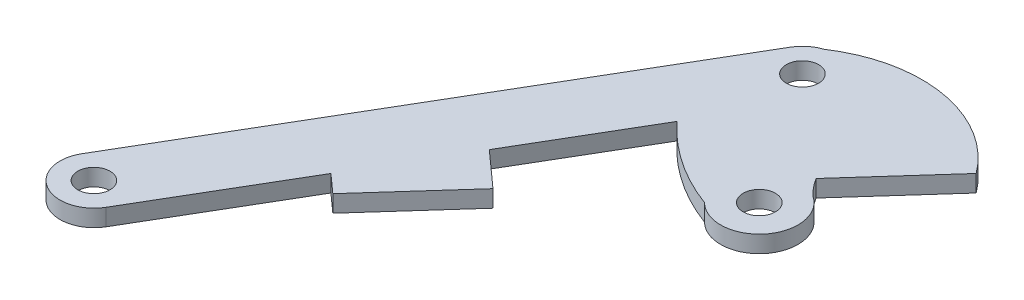
ISO-10303-21;
HEADER;
FILE_DESCRIPTION(('STEP AP214'),'2;1');
FILE_NAME('part.step','',(''),(''),'','','');
FILE_SCHEMA(('AUTOMOTIVE_DESIGN { 1 0 10303 214 1 1 1 1 }'));
ENDSEC;
DATA;
#1=APPLICATION_CONTEXT('core data for automotive mechanical design processes');
#2=APPLICATION_PROTOCOL_DEFINITION('international standard','automotive_design',2000,#1);
#3=PRODUCT_CONTEXT('',#1,'mechanical');
#4=PRODUCT('Part','Part','',(#3));
#5=PRODUCT_RELATED_PRODUCT_CATEGORY('part','',(#4));
#6=PRODUCT_DEFINITION_FORMATION('','',#4);
#7=PRODUCT_DEFINITION_CONTEXT('part definition',#1,'design');
#8=PRODUCT_DEFINITION('design','',#6,#7);
#9=PRODUCT_DEFINITION_SHAPE('','',#8);
#10=(LENGTH_UNIT() NAMED_UNIT(*) SI_UNIT(.MILLI.,.METRE.));
#11=(NAMED_UNIT(*) PLANE_ANGLE_UNIT() SI_UNIT($,.RADIAN.));
#12=(NAMED_UNIT(*) SI_UNIT($,.STERADIAN.) SOLID_ANGLE_UNIT());
#13=UNCERTAINTY_MEASURE_WITH_UNIT(LENGTH_MEASURE(1.E-05),#10,'distance_accuracy_value','');
#14=(GEOMETRIC_REPRESENTATION_CONTEXT(3) GLOBAL_UNCERTAINTY_ASSIGNED_CONTEXT((#13)) GLOBAL_UNIT_ASSIGNED_CONTEXT((#10,
#11,#12)) REPRESENTATION_CONTEXT('',''));
#15=CARTESIAN_POINT('',(0.,0.,0.));
#16=DIRECTION('',(0.,0.,1.));
#17=DIRECTION('',(1.,0.,0.));
#18=AXIS2_PLACEMENT_3D('',#15,#16,#17);
#19=CARTESIAN_POINT('',(28.6202858799555,15.,-380.086840421993));
#20=DIRECTION('',(-0.862539761225924,0.,-0.505989288724895));
#21=DIRECTION('',(-0.505989288724895,0.,0.862539761225924));
#22=AXIS2_PLACEMENT_3D('',#19,#20,#21);
#23=PLANE('',#22);
#24=DIRECTION('',(0.505989288724895,0.,-0.862539761225924));
#25=VECTOR('',#24,1.);
#26=CARTESIAN_POINT('',(28.6202858799555,0.,-380.086840421993));
#27=LINE('',#26,#25);
#28=CARTESIAN_POINT('',(-203.253807163224,0.,15.1796786617365));
#29=VERTEX_POINT('',#28);
#30=CARTESIAN_POINT('',(-129.646022381874,0.,-110.296576516847));
#31=VERTEX_POINT('',#30);
#32=EDGE_CURVE('E227',#29,#31,#27,.T.);
#33=ORIENTED_EDGE('',*,*,#32,.T.);
#34=DIRECTION('',(0.,1.,0.));
#35=VECTOR('',#34,1.);
#36=CARTESIAN_POINT('',(-129.646022381874,0.,-110.296576516847));
#37=LINE('',#36,#35);
#38=CARTESIAN_POINT('',(-129.646022381874,15.,-110.296576516847));
#39=VERTEX_POINT('',#38);
#40=EDGE_CURVE('E206',#31,#39,#37,.T.);
#41=ORIENTED_EDGE('',*,*,#40,.T.);
#42=DIRECTION('',(0.505989288724895,0.,-0.862539761225924));
#43=VECTOR('',#42,1.);
#44=CARTESIAN_POINT('',(28.6202858799555,15.,-380.086840421993));
#45=LINE('',#44,#43);
#46=CARTESIAN_POINT('',(-203.253807163224,15.,15.1796786617365));
#47=VERTEX_POINT('',#46);
#48=EDGE_CURVE('E231',#47,#39,#45,.T.);
#49=ORIENTED_EDGE('',*,*,#48,.F.);
#50=DIRECTION('',(0.,-1.,0.));
#51=VECTOR('',#50,1.);
#52=CARTESIAN_POINT('',(-203.253807163224,15.,15.1796786617365));
#53=LINE('',#52,#51);
#54=EDGE_CURVE('E234',#47,#29,#53,.T.);
#55=ORIENTED_EDGE('',*,*,#54,.T.);
#56=EDGE_LOOP('',(#33,#41,#49,#55));
#57=FACE_BOUND('',#56,.T.);
#58=ADVANCED_FACE('F41',(#57),#23,.F.);
#59=CARTESIAN_POINT('',(2.74409304317788,15.,-395.26651908374));
#60=DIRECTION('',(0.,-1.,0.));
#61=DIRECTION('',(0.,0.,-1.));
#62=AXIS2_PLACEMENT_3D('',#59,#60,#61);
#63=CYLINDRICAL_SURFACE('',#62,29.9999999999999);
#64=CARTESIAN_POINT('',(2.74409304317788,15.,-395.26651908374));
#65=DIRECTION('',(0.,1.,0.));
#66=DIRECTION('',(0.,0.,1.));
#67=AXIS2_PLACEMENT_3D('',#64,#65,#66);
#68=CIRCLE('',#67,29.9999999999999);
#69=CARTESIAN_POINT('',(-6.43124203696515,15.,-423.828963414839));
#70=VERTEX_POINT('',#69);
#71=CARTESIAN_POINT('',(-23.1320997935998,15.,-410.446197745487));
#72=VERTEX_POINT('',#71);
#73=EDGE_CURVE('E224',#70,#72,#68,.T.);
#74=ORIENTED_EDGE('',*,*,#73,.F.);
#75=DIRECTION('',(0.,1.,0.));
#76=VECTOR('',#75,1.);
#77=CARTESIAN_POINT('',(-6.43124203696515,0.,-423.828963414839));
#78=LINE('',#77,#76);
#79=CARTESIAN_POINT('',(-6.43124203696515,0.,-423.828963414839));
#80=VERTEX_POINT('',#79);
#81=EDGE_CURVE('E179',#80,#70,#78,.T.);
#82=ORIENTED_EDGE('',*,*,#81,.F.);
#83=CARTESIAN_POINT('',(2.74409304317788,0.,-395.26651908374));
#84=DIRECTION('',(0.,1.,0.));
#85=DIRECTION('',(0.,0.,1.));
#86=AXIS2_PLACEMENT_3D('',#83,#84,#85);
#87=CIRCLE('',#86,29.9999999999999);
#88=CARTESIAN_POINT('',(-23.1320997935998,0.,-410.446197745487));
#89=VERTEX_POINT('',#88);
#90=EDGE_CURVE('E215',#80,#89,#87,.T.);
#91=ORIENTED_EDGE('',*,*,#90,.T.);
#92=DIRECTION('',(0.,-1.,0.));
#93=VECTOR('',#92,1.);
#94=CARTESIAN_POINT('',(-23.1320997935998,15.,-410.446197745487));
#95=LINE('',#94,#93);
#96=EDGE_CURVE('E11',#72,#89,#95,.T.);
#97=ORIENTED_EDGE('',*,*,#96,.F.);
#98=EDGE_LOOP('',(#74,#82,#91,#97));
#99=FACE_BOUND('',#98,.T.);
#100=ADVANCED_FACE('F43',(#99),#63,.T.);
#101=CARTESIAN_POINT('',(-23.1320997935998,15.,-410.446197745487));
#102=DIRECTION('',(0.862539761225924,0.,0.505989288724895));
#103=DIRECTION('',(0.505989288724895,0.,-0.862539761225924));
#104=AXIS2_PLACEMENT_3D('',#101,#102,#103);
#105=PLANE('',#104);
#106=DIRECTION('',(-0.505989288724895,0.,0.862539761225924));
#107=VECTOR('',#106,1.);
#108=CARTESIAN_POINT('',(-23.1320997935998,0.,-410.446197745487));
#109=LINE('',#108,#107);
#110=CARTESIAN_POINT('',(-255.006192836779,0.,-15.1796786617572));
#111=VERTEX_POINT('',#110);
#112=EDGE_CURVE('E236',#89,#111,#109,.T.);
#113=ORIENTED_EDGE('',*,*,#112,.T.);
#114=DIRECTION('',(0.,-1.,0.));
#115=VECTOR('',#114,1.);
#116=CARTESIAN_POINT('',(-255.006192836779,15.,-15.1796786617572));
#117=LINE('',#116,#115);
#118=CARTESIAN_POINT('',(-255.006192836779,15.,-15.1796786617572));
#119=VERTEX_POINT('',#118);
#120=EDGE_CURVE('E49',#119,#111,#117,.T.);
#121=ORIENTED_EDGE('',*,*,#120,.F.);
#122=DIRECTION('',(-0.505989288724895,0.,0.862539761225924));
#123=VECTOR('',#122,1.);
#124=CARTESIAN_POINT('',(-23.1320997935998,15.,-410.446197745487));
#125=LINE('',#124,#123);
#126=EDGE_CURVE('E226',#72,#119,#125,.T.);
#127=ORIENTED_EDGE('',*,*,#126,.F.);
#128=ORIENTED_EDGE('',*,*,#96,.T.);
#129=EDGE_LOOP('',(#113,#121,#127,#128));
#130=FACE_BOUND('',#129,.T.);
#131=ADVANCED_FACE('F268',(#130),#105,.F.);
#132=CARTESIAN_POINT('',(-229.130000000002,15.,-1.0315369633621E-11));
#133=DIRECTION('',(0.,-1.,0.));
#134=DIRECTION('',(0.,0.,-1.));
#135=AXIS2_PLACEMENT_3D('',#132,#133,#134);
#136=CYLINDRICAL_SURFACE('',#135,30.);
#137=CARTESIAN_POINT('',(-229.130000000002,0.,-1.0315369633621E-11));
#138=DIRECTION('',(0.,1.,0.));
#139=DIRECTION('',(0.,0.,1.));
#140=AXIS2_PLACEMENT_3D('',#137,#138,#139);
#141=CIRCLE('',#140,30.);
#142=EDGE_CURVE('E238',#111,#29,#141,.T.);
#143=ORIENTED_EDGE('',*,*,#142,.T.);
#144=ORIENTED_EDGE('',*,*,#54,.F.);
#145=CARTESIAN_POINT('',(-229.130000000002,15.,-1.0315369633621E-11));
#146=DIRECTION('',(0.,1.,0.));
#147=DIRECTION('',(0.,0.,1.));
#148=AXIS2_PLACEMENT_3D('',#145,#146,#147);
#149=CIRCLE('',#148,30.);
#150=EDGE_CURVE('E229',#119,#47,#149,.T.);
#151=ORIENTED_EDGE('',*,*,#150,.F.);
#152=ORIENTED_EDGE('',*,*,#120,.T.);
#153=EDGE_LOOP('',(#143,#144,#151,#152));
#154=FACE_BOUND('',#153,.T.);
#155=ADVANCED_FACE('F247',(#154),#136,.T.);
#156=CARTESIAN_POINT('',(-77.8156908411286,0.,-198.649675658677));
#157=VERTEX_POINT('',#156);
#158=CARTESIAN_POINT('',(-16.3701082223914,0.,-303.393509849145));
#159=VERTEX_POINT('',#158);
#160=EDGE_CURVE('E61',#157,#159,#27,.T.);
#161=ORIENTED_EDGE('',*,*,#160,.T.);
#162=DIRECTION('',(0.,-1.,0.));
#163=VECTOR('',#162,1.);
#164=CARTESIAN_POINT('',(-16.3701082223914,196.040426616579,-303.393509849145));
#165=LINE('',#164,#163);
#166=CARTESIAN_POINT('',(-16.3701082223914,15.,-303.393509849145));
#167=VERTEX_POINT('',#166);
#168=EDGE_CURVE('E56',#167,#159,#165,.T.);
#169=ORIENTED_EDGE('',*,*,#168,.F.);
#170=CARTESIAN_POINT('',(-77.8156908411286,15.,-198.649675658677));
#171=VERTEX_POINT('',#170);
#172=EDGE_CURVE('E142',#171,#167,#45,.T.);
#173=ORIENTED_EDGE('',*,*,#172,.F.);
#174=DIRECTION('',(0.,1.,0.));
#175=VECTOR('',#174,1.);
#176=CARTESIAN_POINT('',(-77.8156908411286,0.,-198.649675658677));
#177=LINE('',#176,#175);
#178=EDGE_CURVE('E208',#157,#171,#177,.T.);
#179=ORIENTED_EDGE('',*,*,#178,.F.);
#180=EDGE_LOOP('',(#161,#169,#173,#179));
#181=FACE_BOUND('',#180,.T.);
#182=ADVANCED_FACE('F303',(#181),#23,.F.);
#183=CARTESIAN_POINT('',(2.74409304317788,15.,-395.26651908374));
#184=DIRECTION('',(0.,1.,0.));
#185=DIRECTION('',(0.,0.,1.));
#186=AXIS2_PLACEMENT_3D('',#183,#184,#185);
#187=PLANE('',#186);
#188=CARTESIAN_POINT('',(148.601183111279,15.,-357.745879734677));
#189=DIRECTION('',(0.,1.,0.));
#190=DIRECTION('',(0.,0.,1.));
#191=AXIS2_PLACEMENT_3D('',#188,#189,#190);
#192=CIRCLE('',#191,70.);
#193=CARTESIAN_POINT('',(88.9356046161873,15.,-321.139613292357));
#194=VERTEX_POINT('',#193);
#195=CARTESIAN_POINT('',(101.541302009337,15.,-305.925347214535));
#196=VERTEX_POINT('',#195);
#197=EDGE_CURVE('E164',#194,#196,#192,.T.);
#198=ORIENTED_EDGE('',*,*,#197,.F.);
#199=DIRECTION('',(0.667622170074029,0.,-0.744500260594746));
#200=VECTOR('',#199,1.);
#201=CARTESIAN_POINT('',(155.952842446592,15.,-395.874026356477));
#202=LINE('',#201,#200);
#203=CARTESIAN_POINT('',(155.952842446592,15.,-395.874026356477));
#204=VERTEX_POINT('',#203);
#205=EDGE_CURVE('E174',#194,#204,#202,.T.);
#206=ORIENTED_EDGE('',*,*,#205,.T.);
#207=CARTESIAN_POINT('',(59.9582615227793,15.,-323.866801487984));
#208=DIRECTION('',(0.,1.,0.));
#209=DIRECTION('',(0.,0.,-1.));
#210=AXIS2_PLACEMENT_3D('',#207,#208,#209);
#211=CIRCLE('',#210,120.000000000001);
#212=EDGE_CURVE('E171',#204,#70,#211,.T.);
#213=ORIENTED_EDGE('',*,*,#212,.T.);
#214=ORIENTED_EDGE('',*,*,#73,.T.);
#215=ORIENTED_EDGE('',*,*,#126,.T.);
#216=ORIENTED_EDGE('',*,*,#150,.T.);
#217=ORIENTED_EDGE('',*,*,#48,.T.);
#218=DIRECTION('',(0.744500260594745,0.,0.667622170074029));
#219=VECTOR('',#218,1.);
#220=CARTESIAN_POINT('',(-113.288910537064,15.,-95.6285218713703));
#221=LINE('',#220,#219);
#222=CARTESIAN_POINT('',(-113.288910537064,15.,-95.6285218713703));
#223=VERTEX_POINT('',#222);
#224=EDGE_CURVE('E190',#39,#223,#221,.T.);
#225=ORIENTED_EDGE('',*,*,#224,.T.);
#226=DIRECTION('',(0.667622170074029,0.,-0.744500260594746));
#227=VECTOR('',#226,1.);
#228=CARTESIAN_POINT('',(-46.2716727066594,15.,-170.36293493549));
#229=LINE('',#228,#227);
#230=CARTESIAN_POINT('',(-46.2716727066594,15.,-170.36293493549));
#231=VERTEX_POINT('',#230);
#232=EDGE_CURVE('E181',#223,#231,#229,.T.);
#233=ORIENTED_EDGE('',*,*,#232,.T.);
#234=DIRECTION('',(-0.744500260594746,0.,-0.667622170074029));
#235=VECTOR('',#234,1.);
#236=CARTESIAN_POINT('',(-77.8156908411286,15.,-198.649675658677));
#237=LINE('',#236,#235);
#238=EDGE_CURVE('E199',#231,#171,#237,.T.);
#239=ORIENTED_EDGE('',*,*,#238,.T.);
#240=ORIENTED_EDGE('',*,*,#172,.T.);
#241=CARTESIAN_POINT('',(123.925937699389,15.,-431.522427345211));
#242=DIRECTION('',(0.,1.,0.));
#243=DIRECTION('',(0.,0.,1.));
#244=AXIS2_PLACEMENT_3D('',#241,#242,#243);
#245=CIRCLE('',#244,190.);
#246=CARTESIAN_POINT('',(58.0181770932641,15.,-253.31982609628));
#247=VERTEX_POINT('',#246);
#248=EDGE_CURVE('E133',#247,#167,#245,.F.);
#249=ORIENTED_EDGE('',*,*,#248,.F.);
#250=CARTESIAN_POINT('',(82.2648686201507,15.,-277.566517623166));
#251=DIRECTION('',(0.,1.,0.));
#252=DIRECTION('',(0.,0.,1.));
#253=AXIS2_PLACEMENT_3D('',#250,#251,#252);
#254=CIRCLE('',#253,34.29);
#255=EDGE_CURVE('E139',#196,#247,#254,.F.);
#256=ORIENTED_EDGE('',*,*,#255,.F.);
#257=EDGE_LOOP('',(#198,#206,#213,#214,#215,#216,#217,#225,#233,#239,#240,#249,#256));
#258=FACE_BOUND('',#257,.T.);
#259=CARTESIAN_POINT('',(-229.130000000002,15.,-1.0315369633621E-11));
#260=DIRECTION('',(0.,1.,0.));
#261=DIRECTION('',(0.,0.,1.));
#262=AXIS2_PLACEMENT_3D('',#259,#260,#261);
#263=CIRCLE('',#262,14.2899999999983);
#264=CARTESIAN_POINT('',(-229.130000000002,15.,14.289999999988));
#265=VERTEX_POINT('',#264);
#266=EDGE_CURVE('E216',#265,#265,#263,.T.);
#267=ORIENTED_EDGE('',*,*,#266,.F.);
#268=EDGE_LOOP('',(#267));
#269=FACE_BOUND('',#268,.T.);
#270=CARTESIAN_POINT('',(2.74409304317788,15.,-395.26651908374));
#271=DIRECTION('',(0.,1.,0.));
#272=DIRECTION('',(0.,0.,1.));
#273=AXIS2_PLACEMENT_3D('',#270,#271,#272);
#274=CIRCLE('',#273,14.2900000000354);
#275=CARTESIAN_POINT('',(2.74409304317788,15.,-380.976519083705));
#276=VERTEX_POINT('',#275);
#277=EDGE_CURVE('E205',#276,#276,#274,.T.);
#278=ORIENTED_EDGE('',*,*,#277,.F.);
#279=EDGE_LOOP('',(#278));
#280=FACE_BOUND('',#279,.T.);
#281=CARTESIAN_POINT('',(82.2648686201507,15.,-277.566517623166));
#282=DIRECTION('',(0.,1.,0.));
#283=DIRECTION('',(0.,0.,1.));
#284=AXIS2_PLACEMENT_3D('',#281,#282,#283);
#285=CIRCLE('',#284,14.29);
#286=CARTESIAN_POINT('',(82.2648686201507,15.,-263.276517623166));
#287=VERTEX_POINT('',#286);
#288=EDGE_CURVE('E162',#287,#287,#285,.F.);
#289=ORIENTED_EDGE('',*,*,#288,.T.);
#290=EDGE_LOOP('',(#289));
#291=FACE_BOUND('',#290,.T.);
#292=ADVANCED_FACE('F136',(#258,#269,#280,#291),#187,.T.);
#293=CARTESIAN_POINT('',(2.74409304317788,0.,-395.26651908374));
#294=DIRECTION('',(0.,1.,0.));
#295=DIRECTION('',(0.,0.,1.));
#296=AXIS2_PLACEMENT_3D('',#293,#294,#295);
#297=PLANE('',#296);
#298=CARTESIAN_POINT('',(123.925937699389,0.,-431.522427345211));
#299=DIRECTION('',(0.,-1.,0.));
#300=DIRECTION('',(0.,0.,-1.));
#301=AXIS2_PLACEMENT_3D('',#298,#299,#300);
#302=CIRCLE('',#301,190.);
#303=CARTESIAN_POINT('',(58.0181770932641,0.,-253.31982609628));
#304=VERTEX_POINT('',#303);
#305=EDGE_CURVE('E150',#304,#159,#302,.T.);
#306=ORIENTED_EDGE('',*,*,#305,.T.);
#307=ORIENTED_EDGE('',*,*,#160,.F.);
#308=DIRECTION('',(-0.744500260594746,0.,-0.667622170074029));
#309=VECTOR('',#308,1.);
#310=CARTESIAN_POINT('',(-77.8156908411286,0.,-198.649675658677));
#311=LINE('',#310,#309);
#312=CARTESIAN_POINT('',(-46.2716727066594,0.,-170.36293493549));
#313=VERTEX_POINT('',#312);
#314=EDGE_CURVE('E189',#313,#157,#311,.T.);
#315=ORIENTED_EDGE('',*,*,#314,.F.);
#316=DIRECTION('',(0.667622170074029,0.,-0.744500260594746));
#317=VECTOR('',#316,1.);
#318=CARTESIAN_POINT('',(-46.2716727066594,0.,-170.36293493549));
#319=LINE('',#318,#317);
#320=CARTESIAN_POINT('',(-113.288910537064,0.,-95.6285218713703));
#321=VERTEX_POINT('',#320);
#322=EDGE_CURVE('E186',#321,#313,#319,.T.);
#323=ORIENTED_EDGE('',*,*,#322,.F.);
#324=DIRECTION('',(0.744500260594745,0.,0.667622170074029));
#325=VECTOR('',#324,1.);
#326=CARTESIAN_POINT('',(-113.288910537064,0.,-95.6285218713703));
#327=LINE('',#326,#325);
#328=EDGE_CURVE('E193',#31,#321,#327,.T.);
#329=ORIENTED_EDGE('',*,*,#328,.F.);
#330=ORIENTED_EDGE('',*,*,#32,.F.);
#331=ORIENTED_EDGE('',*,*,#142,.F.);
#332=ORIENTED_EDGE('',*,*,#112,.F.);
#333=ORIENTED_EDGE('',*,*,#90,.F.);
#334=CARTESIAN_POINT('',(59.9582615227793,0.,-323.866801487984));
#335=DIRECTION('',(0.,1.,0.));
#336=DIRECTION('',(0.,0.,-1.));
#337=AXIS2_PLACEMENT_3D('',#334,#335,#336);
#338=CIRCLE('',#337,120.000000000001);
#339=CARTESIAN_POINT('',(155.952842446592,0.,-395.874026356477));
#340=VERTEX_POINT('',#339);
#341=EDGE_CURVE('E170',#340,#80,#338,.T.);
#342=ORIENTED_EDGE('',*,*,#341,.F.);
#343=DIRECTION('',(0.667622170074029,0.,-0.744500260594746));
#344=VECTOR('',#343,1.);
#345=CARTESIAN_POINT('',(155.952842446592,0.,-395.874026356477));
#346=LINE('',#345,#344);
#347=CARTESIAN_POINT('',(88.9356046161873,0.,-321.139613292357));
#348=VERTEX_POINT('',#347);
#349=EDGE_CURVE('E167',#348,#340,#346,.T.);
#350=ORIENTED_EDGE('',*,*,#349,.F.);
#351=CARTESIAN_POINT('',(148.601183111279,0.,-357.745879734677));
#352=DIRECTION('',(0.,1.,0.));
#353=DIRECTION('',(0.,0.,-1.));
#354=AXIS2_PLACEMENT_3D('',#351,#352,#353);
#355=CIRCLE('',#354,70.);
#356=CARTESIAN_POINT('',(101.541302009337,0.,-305.925347214535));
#357=VERTEX_POINT('',#356);
#358=EDGE_CURVE('E281',#348,#357,#355,.T.);
#359=ORIENTED_EDGE('',*,*,#358,.T.);
#360=CARTESIAN_POINT('',(82.2648686201507,0.,-277.566517623166));
#361=DIRECTION('',(0.,-1.,0.));
#362=DIRECTION('',(0.,0.,-1.));
#363=AXIS2_PLACEMENT_3D('',#360,#361,#362);
#364=CIRCLE('',#363,34.29);
#365=EDGE_CURVE('E282',#357,#304,#364,.T.);
#366=ORIENTED_EDGE('',*,*,#365,.T.);
#367=EDGE_LOOP('',(#306,#307,#315,#323,#329,#330,#331,#332,#333,#342,#350,#359,#366));
#368=FACE_BOUND('',#367,.T.);
#369=CARTESIAN_POINT('',(-229.130000000002,0.,-1.0315369633621E-11));
#370=DIRECTION('',(0.,1.,0.));
#371=DIRECTION('',(0.,0.,1.));
#372=AXIS2_PLACEMENT_3D('',#369,#370,#371);
#373=CIRCLE('',#372,14.2899999999983);
#374=CARTESIAN_POINT('',(-229.130000000002,0.,14.289999999988));
#375=VERTEX_POINT('',#374);
#376=EDGE_CURVE('E212',#375,#375,#373,.T.);
#377=ORIENTED_EDGE('',*,*,#376,.T.);
#378=EDGE_LOOP('',(#377));
#379=FACE_BOUND('',#378,.T.);
#380=CARTESIAN_POINT('',(2.74409304317788,0.,-395.26651908374));
#381=DIRECTION('',(0.,1.,0.));
#382=DIRECTION('',(0.,0.,1.));
#383=AXIS2_PLACEMENT_3D('',#380,#381,#382);
#384=CIRCLE('',#383,14.2900000000354);
#385=CARTESIAN_POINT('',(2.74409304317788,0.,-380.976519083705));
#386=VERTEX_POINT('',#385);
#387=EDGE_CURVE('E219',#386,#386,#384,.T.);
#388=ORIENTED_EDGE('',*,*,#387,.T.);
#389=EDGE_LOOP('',(#388));
#390=FACE_BOUND('',#389,.T.);
#391=CARTESIAN_POINT('',(82.2648686201507,0.,-277.566517623166));
#392=DIRECTION('',(0.,-1.,0.));
#393=DIRECTION('',(0.,0.,-1.));
#394=AXIS2_PLACEMENT_3D('',#391,#392,#393);
#395=CIRCLE('',#394,14.29);
#396=CARTESIAN_POINT('',(82.2648686201507,0.,-291.856517623166));
#397=VERTEX_POINT('',#396);
#398=EDGE_CURVE('E154',#397,#397,#395,.T.);
#399=ORIENTED_EDGE('',*,*,#398,.F.);
#400=EDGE_LOOP('',(#399));
#401=FACE_BOUND('',#400,.T.);
#402=ADVANCED_FACE('F254',(#368,#379,#390,#401),#297,.F.);
#403=CARTESIAN_POINT('',(2.74409304317788,0.,-395.26651908374));
#404=DIRECTION('',(0.,1.,0.));
#405=DIRECTION('',(0.,0.,1.));
#406=AXIS2_PLACEMENT_3D('',#403,#404,#405);
#407=CYLINDRICAL_SURFACE('',#406,14.2900000000354);
#408=ORIENTED_EDGE('',*,*,#387,.F.);
#409=EDGE_LOOP('',(#408));
#410=FACE_BOUND('',#409,.T.);
#411=ORIENTED_EDGE('',*,*,#277,.T.);
#412=EDGE_LOOP('',(#411));
#413=FACE_BOUND('',#412,.T.);
#414=ADVANCED_FACE('F364',(#410,#413),#407,.F.);
#415=CARTESIAN_POINT('',(-229.130000000002,0.,-1.0315369633621E-11));
#416=DIRECTION('',(0.,1.,0.));
#417=DIRECTION('',(0.,0.,1.));
#418=AXIS2_PLACEMENT_3D('',#415,#416,#417);
#419=CYLINDRICAL_SURFACE('',#418,14.2899999999983);
#420=ORIENTED_EDGE('',*,*,#376,.F.);
#421=EDGE_LOOP('',(#420));
#422=FACE_BOUND('',#421,.T.);
#423=ORIENTED_EDGE('',*,*,#266,.T.);
#424=EDGE_LOOP('',(#423));
#425=FACE_BOUND('',#424,.T.);
#426=ADVANCED_FACE('F418',(#422,#425),#419,.F.);
#427=CARTESIAN_POINT('',(-46.2716727066594,0.,-170.36293493549));
#428=DIRECTION('',(0.744500260594746,0.,0.667622170074029));
#429=DIRECTION('',(0.667622170074029,0.,-0.744500260594746));
#430=AXIS2_PLACEMENT_3D('',#427,#428,#429);
#431=PLANE('',#430);
#432=ORIENTED_EDGE('',*,*,#232,.F.);
#433=DIRECTION('',(0.,1.,0.));
#434=VECTOR('',#433,1.);
#435=CARTESIAN_POINT('',(-113.288910537064,0.,-95.6285218713703));
#436=LINE('',#435,#434);
#437=EDGE_CURVE('E203',#321,#223,#436,.T.);
#438=ORIENTED_EDGE('',*,*,#437,.F.);
#439=ORIENTED_EDGE('',*,*,#322,.T.);
#440=DIRECTION('',(0.,1.,0.));
#441=VECTOR('',#440,1.);
#442=CARTESIAN_POINT('',(-46.2716727066594,0.,-170.36293493549));
#443=LINE('',#442,#441);
#444=EDGE_CURVE('E196',#313,#231,#443,.T.);
#445=ORIENTED_EDGE('',*,*,#444,.T.);
#446=EDGE_LOOP('',(#432,#438,#439,#445));
#447=FACE_BOUND('',#446,.T.);
#448=ADVANCED_FACE('F412',(#447),#431,.T.);
#449=CARTESIAN_POINT('',(-113.288910537064,0.,-95.6285218713703));
#450=DIRECTION('',(-0.667622170074029,0.,0.744500260594745));
#451=DIRECTION('',(0.744500260594745,0.,0.667622170074029));
#452=AXIS2_PLACEMENT_3D('',#449,#450,#451);
#453=PLANE('',#452);
#454=ORIENTED_EDGE('',*,*,#224,.F.);
#455=ORIENTED_EDGE('',*,*,#40,.F.);
#456=ORIENTED_EDGE('',*,*,#328,.T.);
#457=ORIENTED_EDGE('',*,*,#437,.T.);
#458=EDGE_LOOP('',(#454,#455,#456,#457));
#459=FACE_BOUND('',#458,.T.);
#460=ADVANCED_FACE('F264',(#459),#453,.T.);
#461=CARTESIAN_POINT('',(-77.8156908411286,0.,-198.649675658677));
#462=DIRECTION('',(0.667622170074029,0.,-0.744500260594746));
#463=DIRECTION('',(-0.744500260594746,0.,-0.667622170074029));
#464=AXIS2_PLACEMENT_3D('',#461,#462,#463);
#465=PLANE('',#464);
#466=ORIENTED_EDGE('',*,*,#238,.F.);
#467=ORIENTED_EDGE('',*,*,#444,.F.);
#468=ORIENTED_EDGE('',*,*,#314,.T.);
#469=ORIENTED_EDGE('',*,*,#178,.T.);
#470=EDGE_LOOP('',(#466,#467,#468,#469));
#471=FACE_BOUND('',#470,.T.);
#472=ADVANCED_FACE('F333',(#471),#465,.T.);
#473=CARTESIAN_POINT('',(59.9582615227793,0.,-323.866801487984));
#474=DIRECTION('',(0.,1.,0.));
#475=DIRECTION('',(0.,0.,1.));
#476=AXIS2_PLACEMENT_3D('',#473,#474,#475);
#477=CYLINDRICAL_SURFACE('',#476,120.000000000001);
#478=ORIENTED_EDGE('',*,*,#212,.F.);
#479=DIRECTION('',(0.,1.,0.));
#480=VECTOR('',#479,1.);
#481=CARTESIAN_POINT('',(155.952842446592,0.,-395.874026356477));
#482=LINE('',#481,#480);
#483=EDGE_CURVE('E182',#340,#204,#482,.T.);
#484=ORIENTED_EDGE('',*,*,#483,.F.);
#485=ORIENTED_EDGE('',*,*,#341,.T.);
#486=ORIENTED_EDGE('',*,*,#81,.T.);
#487=EDGE_LOOP('',(#478,#484,#485,#486));
#488=FACE_BOUND('',#487,.T.);
#489=ADVANCED_FACE('F338',(#488),#477,.T.);
#490=CARTESIAN_POINT('',(155.952842446592,0.,-395.874026356477));
#491=DIRECTION('',(0.744500260594746,0.,0.667622170074029));
#492=DIRECTION('',(0.667622170074029,0.,-0.744500260594746));
#493=AXIS2_PLACEMENT_3D('',#490,#491,#492);
#494=PLANE('',#493);
#495=ORIENTED_EDGE('',*,*,#205,.F.);
#496=DIRECTION('',(0.,1.,0.));
#497=VECTOR('',#496,1.);
#498=CARTESIAN_POINT('',(88.9356046161873,0.,-321.139613292357));
#499=LINE('',#498,#497);
#500=EDGE_CURVE('E173',#348,#194,#499,.T.);
#501=ORIENTED_EDGE('',*,*,#500,.F.);
#502=ORIENTED_EDGE('',*,*,#349,.T.);
#503=ORIENTED_EDGE('',*,*,#483,.T.);
#504=EDGE_LOOP('',(#495,#501,#502,#503));
#505=FACE_BOUND('',#504,.T.);
#506=ADVANCED_FACE('F277',(#505),#494,.T.);
#507=CARTESIAN_POINT('',(148.601183111279,196.040426616579,-357.745879734677));
#508=DIRECTION('',(0.,-1.,0.));
#509=DIRECTION('',(0.,0.,-1.));
#510=AXIS2_PLACEMENT_3D('',#507,#508,#509);
#511=CYLINDRICAL_SURFACE('',#510,70.);
#512=ORIENTED_EDGE('',*,*,#500,.T.);
#513=ORIENTED_EDGE('',*,*,#197,.T.);
#514=DIRECTION('',(0.,-1.,0.));
#515=VECTOR('',#514,1.);
#516=CARTESIAN_POINT('',(101.541302009337,196.040426616579,-305.925347214535));
#517=LINE('',#516,#515);
#518=EDGE_CURVE('E144',#196,#357,#517,.T.);
#519=ORIENTED_EDGE('',*,*,#518,.T.);
#520=ORIENTED_EDGE('',*,*,#358,.F.);
#521=EDGE_LOOP('',(#512,#513,#519,#520));
#522=FACE_BOUND('',#521,.T.);
#523=ADVANCED_FACE('F280',(#522),#511,.F.);
#524=CARTESIAN_POINT('',(123.925937699389,196.040426616579,-431.522427345211));
#525=DIRECTION('',(0.,-1.,0.));
#526=DIRECTION('',(0.,0.,-1.));
#527=AXIS2_PLACEMENT_3D('',#524,#525,#526);
#528=CYLINDRICAL_SURFACE('',#527,190.);
#529=DIRECTION('',(0.,-1.,0.));
#530=VECTOR('',#529,1.);
#531=CARTESIAN_POINT('',(58.0181770932641,196.040426616579,-253.31982609628));
#532=LINE('',#531,#530);
#533=EDGE_CURVE('E147',#247,#304,#532,.T.);
#534=ORIENTED_EDGE('',*,*,#533,.F.);
#535=ORIENTED_EDGE('',*,*,#248,.T.);
#536=ORIENTED_EDGE('',*,*,#168,.T.);
#537=ORIENTED_EDGE('',*,*,#305,.F.);
#538=EDGE_LOOP('',(#534,#535,#536,#537));
#539=FACE_BOUND('',#538,.T.);
#540=ADVANCED_FACE('F148',(#539),#528,.T.);
#541=CARTESIAN_POINT('',(82.2648686201507,196.040426616579,-277.566517623166));
#542=DIRECTION('',(0.,-1.,0.));
#543=DIRECTION('',(0.,0.,-1.));
#544=AXIS2_PLACEMENT_3D('',#541,#542,#543);
#545=CYLINDRICAL_SURFACE('',#544,34.29);
#546=ORIENTED_EDGE('',*,*,#518,.F.);
#547=ORIENTED_EDGE('',*,*,#255,.T.);
#548=ORIENTED_EDGE('',*,*,#533,.T.);
#549=ORIENTED_EDGE('',*,*,#365,.F.);
#550=EDGE_LOOP('',(#546,#547,#548,#549));
#551=FACE_BOUND('',#550,.T.);
#552=ADVANCED_FACE('F157',(#551),#545,.T.);
#553=CARTESIAN_POINT('',(82.2648686201507,196.040426616579,-277.566517623166));
#554=DIRECTION('',(0.,-1.,0.));
#555=DIRECTION('',(0.,0.,-1.));
#556=AXIS2_PLACEMENT_3D('',#553,#554,#555);
#557=CYLINDRICAL_SURFACE('',#556,14.29);
#558=ORIENTED_EDGE('',*,*,#398,.T.);
#559=EDGE_LOOP('',(#558));
#560=FACE_BOUND('',#559,.T.);
#561=ORIENTED_EDGE('',*,*,#288,.F.);
#562=EDGE_LOOP('',(#561));
#563=FACE_BOUND('',#562,.T.);
#564=ADVANCED_FACE('F291',(#560,#563),#557,.F.);
#565=CLOSED_SHELL('',(#58,#100,#131,#155,#182,#292,#402,#414,#426,#448,#460,#472,#489,#506,#523,
#540,#552,#564));
#566=MANIFOLD_SOLID_BREP('B2',#565);
#567=ADVANCED_BREP_SHAPE_REPRESENTATION('',(#18,#566),#14);
#568=SHAPE_DEFINITION_REPRESENTATION(#9,#567);
ENDSEC;
END-ISO-10303-21;
